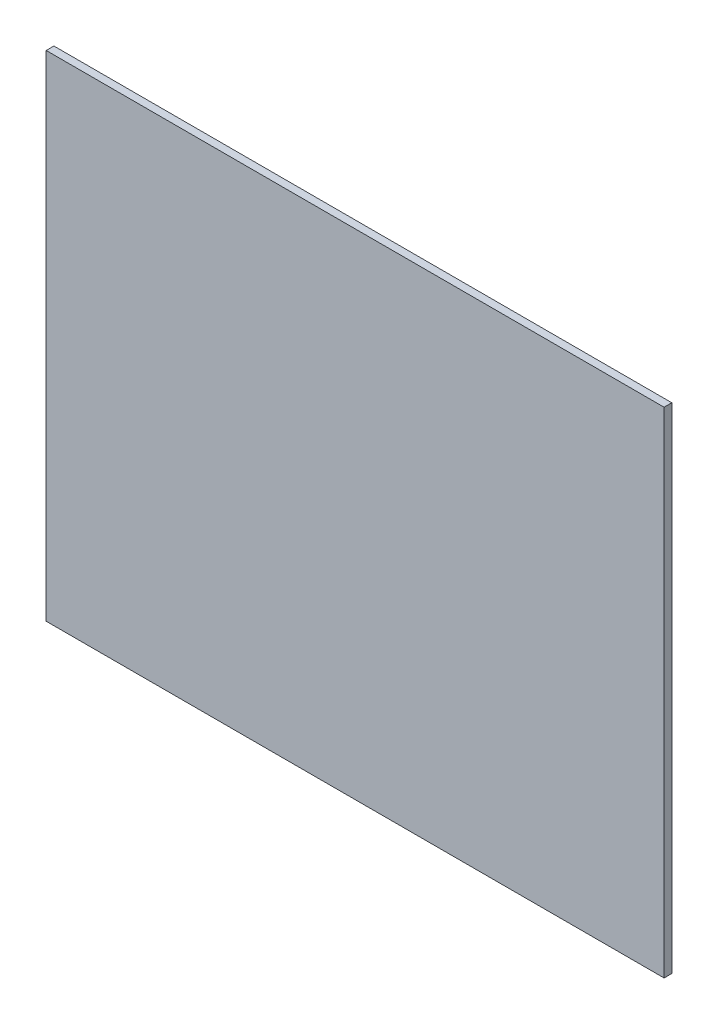
ISO-10303-21;
HEADER;
FILE_DESCRIPTION(('STEP AP214'),'2;1');
FILE_NAME('part.step','',(''),(''),'','','');
FILE_SCHEMA(('AUTOMOTIVE_DESIGN { 1 0 10303 214 1 1 1 1 }'));
ENDSEC;
DATA;
#1=APPLICATION_CONTEXT('core data for automotive mechanical design processes');
#2=APPLICATION_PROTOCOL_DEFINITION('international standard','automotive_design',2000,#1);
#3=PRODUCT_CONTEXT('',#1,'mechanical');
#4=PRODUCT('Part','Part','',(#3));
#5=PRODUCT_RELATED_PRODUCT_CATEGORY('part','',(#4));
#6=PRODUCT_DEFINITION_FORMATION('','',#4);
#7=PRODUCT_DEFINITION_CONTEXT('part definition',#1,'design');
#8=PRODUCT_DEFINITION('design','',#6,#7);
#9=PRODUCT_DEFINITION_SHAPE('','',#8);
#10=(LENGTH_UNIT() NAMED_UNIT(*) SI_UNIT(.MILLI.,.METRE.));
#11=(NAMED_UNIT(*) PLANE_ANGLE_UNIT() SI_UNIT($,.RADIAN.));
#12=(NAMED_UNIT(*) SI_UNIT($,.STERADIAN.) SOLID_ANGLE_UNIT());
#13=UNCERTAINTY_MEASURE_WITH_UNIT(LENGTH_MEASURE(1.E-05),#10,'distance_accuracy_value','');
#14=(GEOMETRIC_REPRESENTATION_CONTEXT(3) GLOBAL_UNCERTAINTY_ASSIGNED_CONTEXT((#13)) GLOBAL_UNIT_ASSIGNED_CONTEXT((#10,
#11,#12)) REPRESENTATION_CONTEXT('',''));
#15=CARTESIAN_POINT('',(0.,0.,0.));
#16=DIRECTION('',(0.,0.,1.));
#17=DIRECTION('',(1.,0.,0.));
#18=AXIS2_PLACEMENT_3D('',#15,#16,#17);
#19=CARTESIAN_POINT('',(0.,0.,3.175));
#20=DIRECTION('',(-1.,0.,0.));
#21=DIRECTION('',(0.,-1.,0.));
#22=AXIS2_PLACEMENT_3D('',#19,#20,#21);
#23=PLANE('',#22);
#24=DIRECTION('',(0.,1.,0.));
#25=VECTOR('',#24,1.);
#26=CARTESIAN_POINT('',(0.,0.,0.));
#27=LINE('',#26,#25);
#28=CARTESIAN_POINT('',(0.,0.,0.));
#29=VERTEX_POINT('',#28);
#30=CARTESIAN_POINT('',(0.,203.2,0.));
#31=VERTEX_POINT('',#30);
#32=EDGE_CURVE('E110',#29,#31,#27,.T.);
#33=ORIENTED_EDGE('',*,*,#32,.F.);
#34=DIRECTION('',(0.,0.,-1.));
#35=VECTOR('',#34,1.);
#36=CARTESIAN_POINT('',(0.,0.,3.175));
#37=LINE('',#36,#35);
#38=CARTESIAN_POINT('',(0.,0.,3.175));
#39=VERTEX_POINT('',#38);
#40=EDGE_CURVE('E11',#39,#29,#37,.T.);
#41=ORIENTED_EDGE('',*,*,#40,.F.);
#42=DIRECTION('',(0.,1.,0.));
#43=VECTOR('',#42,1.);
#44=CARTESIAN_POINT('',(0.,0.,3.175));
#45=LINE('',#44,#43);
#46=CARTESIAN_POINT('',(0.,203.2,3.175));
#47=VERTEX_POINT('',#46);
#48=EDGE_CURVE('E103',#39,#47,#45,.T.);
#49=ORIENTED_EDGE('',*,*,#48,.T.);
#50=DIRECTION('',(0.,0.,-1.));
#51=VECTOR('',#50,1.);
#52=CARTESIAN_POINT('',(0.,203.2,3.175));
#53=LINE('',#52,#51);
#54=EDGE_CURVE('E42',#47,#31,#53,.T.);
#55=ORIENTED_EDGE('',*,*,#54,.T.);
#56=EDGE_LOOP('',(#33,#41,#49,#55));
#57=FACE_BOUND('',#56,.T.);
#58=ADVANCED_FACE('F39',(#57),#23,.T.);
#59=CARTESIAN_POINT('',(0.,0.,3.175));
#60=DIRECTION('',(0.,1.,0.));
#61=DIRECTION('',(0.,0.,1.));
#62=AXIS2_PLACEMENT_3D('',#59,#60,#61);
#63=PLANE('',#62);
#64=DIRECTION('',(1.,0.,0.));
#65=VECTOR('',#64,1.);
#66=CARTESIAN_POINT('',(0.,0.,0.));
#67=LINE('',#66,#65);
#68=CARTESIAN_POINT('',(254.,0.,0.));
#69=VERTEX_POINT('',#68);
#70=EDGE_CURVE('E73',#29,#69,#67,.T.);
#71=ORIENTED_EDGE('',*,*,#70,.T.);
#72=DIRECTION('',(0.,0.,-1.));
#73=VECTOR('',#72,1.);
#74=CARTESIAN_POINT('',(254.,0.,3.175));
#75=LINE('',#74,#73);
#76=CARTESIAN_POINT('',(254.,0.,3.175));
#77=VERTEX_POINT('',#76);
#78=EDGE_CURVE('E49',#77,#69,#75,.T.);
#79=ORIENTED_EDGE('',*,*,#78,.F.);
#80=DIRECTION('',(1.,0.,0.));
#81=VECTOR('',#80,1.);
#82=CARTESIAN_POINT('',(0.,0.,3.175));
#83=LINE('',#82,#81);
#84=EDGE_CURVE('E90',#39,#77,#83,.T.);
#85=ORIENTED_EDGE('',*,*,#84,.F.);
#86=ORIENTED_EDGE('',*,*,#40,.T.);
#87=EDGE_LOOP('',(#71,#79,#85,#86));
#88=FACE_BOUND('',#87,.T.);
#89=ADVANCED_FACE('F126',(#88),#63,.F.);
#90=CARTESIAN_POINT('',(254.,0.,3.175));
#91=DIRECTION('',(-1.,0.,0.));
#92=DIRECTION('',(0.,0.,1.));
#93=AXIS2_PLACEMENT_3D('',#90,#91,#92);
#94=PLANE('',#93);
#95=DIRECTION('',(0.,1.,0.));
#96=VECTOR('',#95,1.);
#97=CARTESIAN_POINT('',(254.,0.,0.));
#98=LINE('',#97,#96);
#99=CARTESIAN_POINT('',(254.,203.2,0.));
#100=VERTEX_POINT('',#99);
#101=EDGE_CURVE('E98',#69,#100,#98,.T.);
#102=ORIENTED_EDGE('',*,*,#101,.T.);
#103=DIRECTION('',(0.,0.,-1.));
#104=VECTOR('',#103,1.);
#105=CARTESIAN_POINT('',(254.,203.2,3.175));
#106=LINE('',#105,#104);
#107=CARTESIAN_POINT('',(254.,203.2,3.175));
#108=VERTEX_POINT('',#107);
#109=EDGE_CURVE('E95',#108,#100,#106,.T.);
#110=ORIENTED_EDGE('',*,*,#109,.F.);
#111=DIRECTION('',(0.,1.,0.));
#112=VECTOR('',#111,1.);
#113=CARTESIAN_POINT('',(254.,0.,3.175));
#114=LINE('',#113,#112);
#115=EDGE_CURVE('E85',#77,#108,#114,.T.);
#116=ORIENTED_EDGE('',*,*,#115,.F.);
#117=ORIENTED_EDGE('',*,*,#78,.T.);
#118=EDGE_LOOP('',(#102,#110,#116,#117));
#119=FACE_BOUND('',#118,.T.);
#120=ADVANCED_FACE('F96',(#119),#94,.F.);
#121=CARTESIAN_POINT('',(0.,203.2,3.175));
#122=DIRECTION('',(0.,1.,0.));
#123=DIRECTION('',(0.,0.,1.));
#124=AXIS2_PLACEMENT_3D('',#121,#122,#123);
#125=PLANE('',#124);
#126=DIRECTION('',(1.,0.,0.));
#127=VECTOR('',#126,1.);
#128=CARTESIAN_POINT('',(0.,203.2,0.));
#129=LINE('',#128,#127);
#130=EDGE_CURVE('E114',#31,#100,#129,.T.);
#131=ORIENTED_EDGE('',*,*,#130,.F.);
#132=ORIENTED_EDGE('',*,*,#54,.F.);
#133=DIRECTION('',(1.,0.,0.));
#134=VECTOR('',#133,1.);
#135=CARTESIAN_POINT('',(0.,203.2,3.175));
#136=LINE('',#135,#134);
#137=EDGE_CURVE('E89',#47,#108,#136,.T.);
#138=ORIENTED_EDGE('',*,*,#137,.T.);
#139=ORIENTED_EDGE('',*,*,#109,.T.);
#140=EDGE_LOOP('',(#131,#132,#138,#139));
#141=FACE_BOUND('',#140,.T.);
#142=ADVANCED_FACE('F101',(#141),#125,.T.);
#143=CARTESIAN_POINT('',(0.,0.,3.175));
#144=DIRECTION('',(0.,0.,-1.));
#145=DIRECTION('',(-1.,0.,0.));
#146=AXIS2_PLACEMENT_3D('',#143,#144,#145);
#147=PLANE('',#146);
#148=ORIENTED_EDGE('',*,*,#48,.F.);
#149=ORIENTED_EDGE('',*,*,#84,.T.);
#150=ORIENTED_EDGE('',*,*,#115,.T.);
#151=ORIENTED_EDGE('',*,*,#137,.F.);
#152=EDGE_LOOP('',(#148,#149,#150,#151));
#153=FACE_BOUND('',#152,.T.);
#154=ADVANCED_FACE('F88',(#153),#147,.F.);
#155=CARTESIAN_POINT('',(0.,0.,0.));
#156=DIRECTION('',(0.,0.,-1.));
#157=DIRECTION('',(-1.,0.,0.));
#158=AXIS2_PLACEMENT_3D('',#155,#156,#157);
#159=PLANE('',#158);
#160=ORIENTED_EDGE('',*,*,#32,.T.);
#161=ORIENTED_EDGE('',*,*,#130,.T.);
#162=ORIENTED_EDGE('',*,*,#101,.F.);
#163=ORIENTED_EDGE('',*,*,#70,.F.);
#164=EDGE_LOOP('',(#160,#161,#162,#163));
#165=FACE_BOUND('',#164,.T.);
#166=ADVANCED_FACE('F123',(#165),#159,.T.);
#167=CLOSED_SHELL('',(#58,#89,#120,#142,#154,#166));
#168=MANIFOLD_SOLID_BREP('B2',#167);
#169=ADVANCED_BREP_SHAPE_REPRESENTATION('',(#18,#168),#14);
#170=SHAPE_DEFINITION_REPRESENTATION(#9,#169);
ENDSEC;
END-ISO-10303-21;
